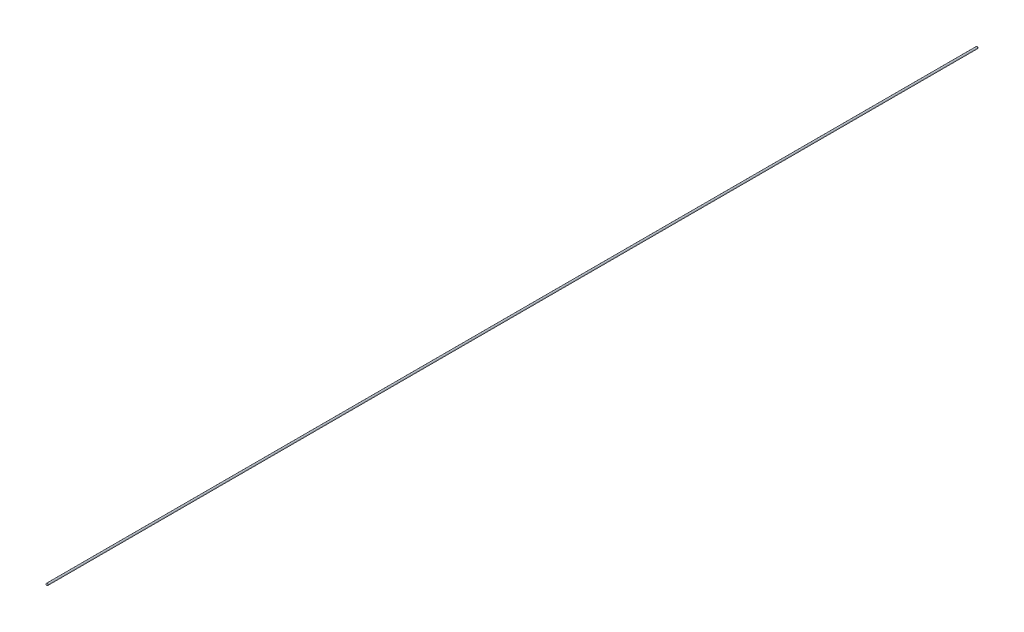
ISO-10303-21;
HEADER;
FILE_DESCRIPTION(('STEP AP214'),'2;1');
FILE_NAME('part.step','',(''),(''),'','','');
FILE_SCHEMA(('AUTOMOTIVE_DESIGN { 1 0 10303 214 1 1 1 1 }'));
ENDSEC;
DATA;
#1=APPLICATION_CONTEXT('core data for automotive mechanical design processes');
#2=APPLICATION_PROTOCOL_DEFINITION('international standard','automotive_design',2000,#1);
#3=PRODUCT_CONTEXT('',#1,'mechanical');
#4=PRODUCT('Part','Part','',(#3));
#5=PRODUCT_RELATED_PRODUCT_CATEGORY('part','',(#4));
#6=PRODUCT_DEFINITION_FORMATION('','',#4);
#7=PRODUCT_DEFINITION_CONTEXT('part definition',#1,'design');
#8=PRODUCT_DEFINITION('design','',#6,#7);
#9=PRODUCT_DEFINITION_SHAPE('','',#8);
#10=(LENGTH_UNIT() NAMED_UNIT(*) SI_UNIT(.MILLI.,.METRE.));
#11=(NAMED_UNIT(*) PLANE_ANGLE_UNIT() SI_UNIT($,.RADIAN.));
#12=(NAMED_UNIT(*) SI_UNIT($,.STERADIAN.) SOLID_ANGLE_UNIT());
#13=UNCERTAINTY_MEASURE_WITH_UNIT(LENGTH_MEASURE(1.E-05),#10,'distance_accuracy_value','');
#14=(GEOMETRIC_REPRESENTATION_CONTEXT(3) GLOBAL_UNCERTAINTY_ASSIGNED_CONTEXT((#13)) GLOBAL_UNIT_ASSIGNED_CONTEXT((#10,
#11,#12)) REPRESENTATION_CONTEXT('',''));
#15=CARTESIAN_POINT('',(0.,0.,0.));
#16=DIRECTION('',(0.,0.,1.));
#17=DIRECTION('',(1.,0.,0.));
#18=AXIS2_PLACEMENT_3D('',#15,#16,#17);
#19=CARTESIAN_POINT('',(0.,0.,250.));
#20=DIRECTION('',(0.,0.,-1.));
#21=DIRECTION('',(-1.,0.,0.));
#22=AXIS2_PLACEMENT_3D('',#19,#20,#21);
#23=CYLINDRICAL_SURFACE('',#22,0.5);
#24=CARTESIAN_POINT('',(0.,0.,249.6));
#25=DIRECTION('',(0.,0.,1.));
#26=DIRECTION('',(1.,0.,0.));
#27=AXIS2_PLACEMENT_3D('',#24,#25,#26);
#28=CIRCLE('',#27,0.5);
#29=CARTESIAN_POINT('',(0.5,0.,249.6));
#30=VERTEX_POINT('',#29);
#31=EDGE_CURVE('E45',#30,#30,#28,.F.);
#32=ORIENTED_EDGE('',*,*,#31,.T.);
#33=EDGE_LOOP('',(#32));
#34=FACE_BOUND('',#33,.T.);
#35=CARTESIAN_POINT('',(0.,0.,-249.6));
#36=DIRECTION('',(0.,0.,1.));
#37=DIRECTION('',(1.,0.,0.));
#38=AXIS2_PLACEMENT_3D('',#35,#36,#37);
#39=CIRCLE('',#38,0.5);
#40=CARTESIAN_POINT('',(0.5,0.,-249.6));
#41=VERTEX_POINT('',#40);
#42=EDGE_CURVE('E50',#41,#41,#39,.T.);
#43=ORIENTED_EDGE('',*,*,#42,.T.);
#44=EDGE_LOOP('',(#43));
#45=FACE_BOUND('',#44,.T.);
#46=ADVANCED_FACE('F37',(#34,#45),#23,.T.);
#47=CARTESIAN_POINT('',(0.,0.,250.));
#48=DIRECTION('',(0.,0.,1.));
#49=DIRECTION('',(1.,0.,0.));
#50=AXIS2_PLACEMENT_3D('',#47,#48,#49);
#51=PLANE('',#50);
#52=CARTESIAN_POINT('',(0.,0.,250.));
#53=DIRECTION('',(0.,0.,1.));
#54=DIRECTION('',(1.,0.,0.));
#55=AXIS2_PLACEMENT_3D('',#52,#53,#54);
#56=CIRCLE('',#55,0.1);
#57=CARTESIAN_POINT('',(0.1,0.,250.));
#58=VERTEX_POINT('',#57);
#59=EDGE_CURVE('E55',#58,#58,#56,.T.);
#60=ORIENTED_EDGE('',*,*,#59,.T.);
#61=EDGE_LOOP('',(#60));
#62=FACE_BOUND('',#61,.T.);
#63=ADVANCED_FACE('F62',(#62),#51,.T.);
#64=CARTESIAN_POINT('',(0.,0.,-250.));
#65=DIRECTION('',(0.,0.,1.));
#66=DIRECTION('',(1.,0.,0.));
#67=AXIS2_PLACEMENT_3D('',#64,#65,#66);
#68=PLANE('',#67);
#69=CARTESIAN_POINT('',(0.,0.,-250.));
#70=DIRECTION('',(0.,0.,1.));
#71=DIRECTION('',(1.,0.,0.));
#72=AXIS2_PLACEMENT_3D('',#69,#70,#71);
#73=CIRCLE('',#72,0.1);
#74=CARTESIAN_POINT('',(0.1,0.,-250.));
#75=VERTEX_POINT('',#74);
#76=EDGE_CURVE('E10',#75,#75,#73,.F.);
#77=ORIENTED_EDGE('',*,*,#76,.T.);
#78=EDGE_LOOP('',(#77));
#79=FACE_BOUND('',#78,.T.);
#80=ADVANCED_FACE('F66',(#79),#68,.F.);
#81=CARTESIAN_POINT('',(0.,0.,249.6));
#82=DIRECTION('',(0.,0.,1.));
#83=DIRECTION('',(1.,0.,0.));
#84=AXIS2_PLACEMENT_3D('',#81,#82,#83);
#85=DEGENERATE_TOROIDAL_SURFACE('',#84,0.1,0.4,.T.);
#86=ORIENTED_EDGE('',*,*,#31,.F.);
#87=EDGE_LOOP('',(#86));
#88=FACE_BOUND('',#87,.T.);
#89=ORIENTED_EDGE('',*,*,#59,.F.);
#90=EDGE_LOOP('',(#89));
#91=FACE_BOUND('',#90,.T.);
#92=ADVANCED_FACE('F64',(#88,#91),#85,.T.);
#93=CARTESIAN_POINT('',(0.,0.,-249.6));
#94=DIRECTION('',(0.,0.,1.));
#95=DIRECTION('',(1.,0.,0.));
#96=AXIS2_PLACEMENT_3D('',#93,#94,#95);
#97=DEGENERATE_TOROIDAL_SURFACE('',#96,0.1,0.4,.T.);
#98=ORIENTED_EDGE('',*,*,#76,.F.);
#99=EDGE_LOOP('',(#98));
#100=FACE_BOUND('',#99,.T.);
#101=ORIENTED_EDGE('',*,*,#42,.F.);
#102=EDGE_LOOP('',(#101));
#103=FACE_BOUND('',#102,.T.);
#104=ADVANCED_FACE('F39',(#100,#103),#97,.T.);
#105=CLOSED_SHELL('',(#46,#63,#80,#92,#104));
#106=MANIFOLD_SOLID_BREP('B2',#105);
#107=ADVANCED_BREP_SHAPE_REPRESENTATION('',(#18,#106),#14);
#108=SHAPE_DEFINITION_REPRESENTATION(#9,#107);
ENDSEC;
END-ISO-10303-21;
